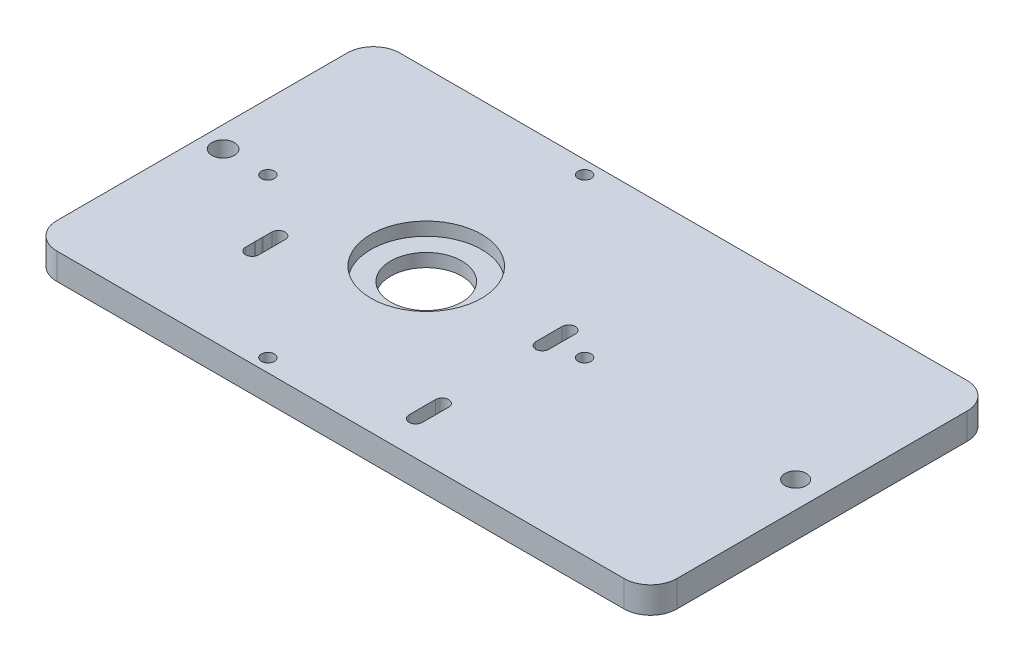
ISO-10303-21;
HEADER;
FILE_DESCRIPTION(('STEP AP214'),'2;1');
FILE_NAME('part.step','',(''),(''),'','','');
FILE_SCHEMA(('AUTOMOTIVE_DESIGN { 1 0 10303 214 1 1 1 1 }'));
ENDSEC;
DATA;
#1=APPLICATION_CONTEXT('core data for automotive mechanical design processes');
#2=APPLICATION_PROTOCOL_DEFINITION('international standard','automotive_design',2000,#1);
#3=PRODUCT_CONTEXT('',#1,'mechanical');
#4=PRODUCT('Part','Part','',(#3));
#5=PRODUCT_RELATED_PRODUCT_CATEGORY('part','',(#4));
#6=PRODUCT_DEFINITION_FORMATION('','',#4);
#7=PRODUCT_DEFINITION_CONTEXT('part definition',#1,'design');
#8=PRODUCT_DEFINITION('design','',#6,#7);
#9=PRODUCT_DEFINITION_SHAPE('','',#8);
#10=(LENGTH_UNIT() NAMED_UNIT(*) SI_UNIT(.MILLI.,.METRE.));
#11=(NAMED_UNIT(*) PLANE_ANGLE_UNIT() SI_UNIT($,.RADIAN.));
#12=(NAMED_UNIT(*) SI_UNIT($,.STERADIAN.) SOLID_ANGLE_UNIT());
#13=UNCERTAINTY_MEASURE_WITH_UNIT(LENGTH_MEASURE(1.E-05),#10,'distance_accuracy_value','');
#14=(GEOMETRIC_REPRESENTATION_CONTEXT(3) GLOBAL_UNCERTAINTY_ASSIGNED_CONTEXT((#13)) GLOBAL_UNIT_ASSIGNED_CONTEXT((#10,
#11,#12)) REPRESENTATION_CONTEXT('',''));
#15=CARTESIAN_POINT('',(0.,0.,0.));
#16=DIRECTION('',(0.,0.,1.));
#17=DIRECTION('',(1.,0.,0.));
#18=AXIS2_PLACEMENT_3D('',#15,#16,#17);
#19=CARTESIAN_POINT('',(-35.5,10.,0.));
#20=DIRECTION('',(1.,0.,0.));
#21=DIRECTION('',(0.,0.,-1.));
#22=AXIS2_PLACEMENT_3D('',#19,#20,#21);
#23=PLANE('',#22);
#24=DIRECTION('',(0.,0.,1.));
#25=VECTOR('',#24,1.);
#26=CARTESIAN_POINT('',(-35.5,0.,0.));
#27=LINE('',#26,#25);
#28=CARTESIAN_POINT('',(-35.5,0.,24.6044361719691));
#29=VERTEX_POINT('',#28);
#30=CARTESIAN_POINT('',(-35.5,0.,28.));
#31=VERTEX_POINT('',#30);
#32=EDGE_CURVE('E359',#29,#31,#27,.T.);
#33=ORIENTED_EDGE('',*,*,#32,.T.);
#34=DIRECTION('',(0.,-1.,0.));
#35=VECTOR('',#34,1.);
#36=CARTESIAN_POINT('',(-35.5,10.,28.));
#37=LINE('',#36,#35);
#38=CARTESIAN_POINT('',(-35.5,10.,28.));
#39=VERTEX_POINT('',#38);
#40=EDGE_CURVE('E409',#39,#31,#37,.T.);
#41=ORIENTED_EDGE('',*,*,#40,.F.);
#42=DIRECTION('',(0.,0.,1.));
#43=VECTOR('',#42,1.);
#44=CARTESIAN_POINT('',(-35.5,10.,0.));
#45=LINE('',#44,#43);
#46=CARTESIAN_POINT('',(-35.5,10.,24.6044361719691));
#47=VERTEX_POINT('',#46);
#48=EDGE_CURVE('E289',#47,#39,#45,.T.);
#49=ORIENTED_EDGE('',*,*,#48,.F.);
#50=DIRECTION('',(0.,-1.,0.));
#51=VECTOR('',#50,1.);
#52=CARTESIAN_POINT('',(-35.5,10.,24.6044361719691));
#53=LINE('',#52,#51);
#54=EDGE_CURVE('E385',#47,#29,#53,.T.);
#55=ORIENTED_EDGE('',*,*,#54,.T.);
#56=EDGE_LOOP('',(#33,#41,#49,#55));
#57=FACE_BOUND('',#56,.T.);
#58=ADVANCED_FACE('F35',(#57),#23,.F.);
#59=CARTESIAN_POINT('',(-38.,10.,28.));
#60=DIRECTION('',(0.,-1.,0.));
#61=DIRECTION('',(0.,0.,-1.));
#62=AXIS2_PLACEMENT_3D('',#59,#60,#61);
#63=CYLINDRICAL_SURFACE('',#62,2.5);
#64=CARTESIAN_POINT('',(-38.,0.,28.));
#65=DIRECTION('',(0.,1.,0.));
#66=DIRECTION('',(0.,0.,1.));
#67=AXIS2_PLACEMENT_3D('',#64,#65,#66);
#68=CIRCLE('',#67,2.5);
#69=CARTESIAN_POINT('',(-40.5,0.,28.));
#70=VERTEX_POINT('',#69);
#71=EDGE_CURVE('E362',#31,#70,#68,.F.);
#72=ORIENTED_EDGE('',*,*,#71,.T.);
#73=DIRECTION('',(0.,-1.,0.));
#74=VECTOR('',#73,1.);
#75=CARTESIAN_POINT('',(-40.5,10.,28.));
#76=LINE('',#75,#74);
#77=CARTESIAN_POINT('',(-40.5,10.,28.));
#78=VERTEX_POINT('',#77);
#79=EDGE_CURVE('E407',#78,#70,#76,.T.);
#80=ORIENTED_EDGE('',*,*,#79,.F.);
#81=CARTESIAN_POINT('',(-38.,10.,28.));
#82=DIRECTION('',(0.,1.,0.));
#83=DIRECTION('',(0.,0.,1.));
#84=AXIS2_PLACEMENT_3D('',#81,#82,#83);
#85=CIRCLE('',#84,2.5);
#86=EDGE_CURVE('E292',#39,#78,#85,.F.);
#87=ORIENTED_EDGE('',*,*,#86,.F.);
#88=ORIENTED_EDGE('',*,*,#40,.T.);
#89=EDGE_LOOP('',(#72,#80,#87,#88));
#90=FACE_BOUND('',#89,.T.);
#91=ADVANCED_FACE('F527',(#90),#63,.F.);
#92=CARTESIAN_POINT('',(-40.5,10.,0.));
#93=DIRECTION('',(1.,0.,0.));
#94=DIRECTION('',(0.,0.,-1.));
#95=AXIS2_PLACEMENT_3D('',#92,#93,#94);
#96=PLANE('',#95);
#97=DIRECTION('',(0.,0.,1.));
#98=VECTOR('',#97,1.);
#99=CARTESIAN_POINT('',(-40.5,0.,0.));
#100=LINE('',#99,#98);
#101=CARTESIAN_POINT('',(-40.5,0.,24.6044361719689));
#102=VERTEX_POINT('',#101);
#103=EDGE_CURVE('E366',#102,#70,#100,.T.);
#104=ORIENTED_EDGE('',*,*,#103,.F.);
#105=DIRECTION('',(0.,-1.,0.));
#106=VECTOR('',#105,1.);
#107=CARTESIAN_POINT('',(-40.5,10.,24.6044361719689));
#108=LINE('',#107,#106);
#109=CARTESIAN_POINT('',(-40.5,10.,24.6044361719689));
#110=VERTEX_POINT('',#109);
#111=EDGE_CURVE('E405',#110,#102,#108,.T.);
#112=ORIENTED_EDGE('',*,*,#111,.F.);
#113=DIRECTION('',(0.,0.,1.));
#114=VECTOR('',#113,1.);
#115=CARTESIAN_POINT('',(-40.5,10.,0.));
#116=LINE('',#115,#114);
#117=EDGE_CURVE('E295',#110,#78,#116,.T.);
#118=ORIENTED_EDGE('',*,*,#117,.T.);
#119=ORIENTED_EDGE('',*,*,#79,.T.);
#120=EDGE_LOOP('',(#104,#112,#118,#119));
#121=FACE_BOUND('',#120,.T.);
#122=ADVANCED_FACE('F534',(#121),#96,.T.);
#123=CARTESIAN_POINT('',(-38.,10.,24.25));
#124=DIRECTION('',(0.,-1.,0.));
#125=DIRECTION('',(0.,0.,-1.));
#126=AXIS2_PLACEMENT_3D('',#123,#124,#125);
#127=CYLINDRICAL_SURFACE('',#126,2.52500000000001);
#128=CARTESIAN_POINT('',(-38.,0.,24.25));
#129=DIRECTION('',(0.,1.,0.));
#130=DIRECTION('',(0.,0.,1.));
#131=AXIS2_PLACEMENT_3D('',#128,#129,#130);
#132=CIRCLE('',#131,2.52500000000001);
#133=CARTESIAN_POINT('',(-40.525,0.,24.25));
#134=VERTEX_POINT('',#133);
#135=EDGE_CURVE('E369',#134,#102,#132,.T.);
#136=ORIENTED_EDGE('',*,*,#135,.F.);
#137=DIRECTION('',(0.,-1.,0.));
#138=VECTOR('',#137,1.);
#139=CARTESIAN_POINT('',(-40.525,10.,24.25));
#140=LINE('',#139,#138);
#141=CARTESIAN_POINT('',(-40.525,10.,24.25));
#142=VERTEX_POINT('',#141);
#143=EDGE_CURVE('E403',#142,#134,#140,.T.);
#144=ORIENTED_EDGE('',*,*,#143,.F.);
#145=CARTESIAN_POINT('',(-38.,10.,24.25));
#146=DIRECTION('',(0.,1.,0.));
#147=DIRECTION('',(0.,0.,1.));
#148=AXIS2_PLACEMENT_3D('',#145,#146,#147);
#149=CIRCLE('',#148,2.52500000000001);
#150=EDGE_CURVE('E298',#142,#110,#149,.T.);
#151=ORIENTED_EDGE('',*,*,#150,.T.);
#152=ORIENTED_EDGE('',*,*,#111,.T.);
#153=EDGE_LOOP('',(#136,#144,#151,#152));
#154=FACE_BOUND('',#153,.T.);
#155=ADVANCED_FACE('F583',(#154),#127,.F.);
#156=CARTESIAN_POINT('',(-40.525,10.,0.));
#157=DIRECTION('',(-1.,0.,0.));
#158=DIRECTION('',(0.,0.,1.));
#159=AXIS2_PLACEMENT_3D('',#156,#157,#158);
#160=PLANE('',#159);
#161=DIRECTION('',(0.,0.,-1.));
#162=VECTOR('',#161,1.);
#163=CARTESIAN_POINT('',(-40.525,0.,0.));
#164=LINE('',#163,#162);
#165=CARTESIAN_POINT('',(-40.525,0.,21.75));
#166=VERTEX_POINT('',#165);
#167=EDGE_CURVE('E373',#134,#166,#164,.T.);
#168=ORIENTED_EDGE('',*,*,#167,.T.);
#169=DIRECTION('',(0.,-1.,0.));
#170=VECTOR('',#169,1.);
#171=CARTESIAN_POINT('',(-40.525,10.,21.75));
#172=LINE('',#171,#170);
#173=CARTESIAN_POINT('',(-40.525,10.,21.75));
#174=VERTEX_POINT('',#173);
#175=EDGE_CURVE('E401',#174,#166,#172,.T.);
#176=ORIENTED_EDGE('',*,*,#175,.F.);
#177=DIRECTION('',(0.,0.,-1.));
#178=VECTOR('',#177,1.);
#179=CARTESIAN_POINT('',(-40.525,10.,0.));
#180=LINE('',#179,#178);
#181=EDGE_CURVE('E302',#142,#174,#180,.T.);
#182=ORIENTED_EDGE('',*,*,#181,.F.);
#183=ORIENTED_EDGE('',*,*,#143,.T.);
#184=EDGE_LOOP('',(#168,#176,#182,#183));
#185=FACE_BOUND('',#184,.T.);
#186=ADVANCED_FACE('F598',(#185),#160,.F.);
#187=CARTESIAN_POINT('',(-38.,10.,21.75));
#188=DIRECTION('',(0.,-1.,0.));
#189=DIRECTION('',(0.,0.,-1.));
#190=AXIS2_PLACEMENT_3D('',#187,#188,#189);
#191=CYLINDRICAL_SURFACE('',#190,2.52500000000001);
#192=CARTESIAN_POINT('',(-38.,0.,21.75));
#193=DIRECTION('',(0.,1.,0.));
#194=DIRECTION('',(0.,0.,1.));
#195=AXIS2_PLACEMENT_3D('',#192,#193,#194);
#196=CIRCLE('',#195,2.52500000000001);
#197=CARTESIAN_POINT('',(-40.5,0.,21.3955638280311));
#198=VERTEX_POINT('',#197);
#199=EDGE_CURVE('E376',#198,#166,#196,.T.);
#200=ORIENTED_EDGE('',*,*,#199,.F.);
#201=DIRECTION('',(0.,-1.,0.));
#202=VECTOR('',#201,1.);
#203=CARTESIAN_POINT('',(-40.5,10.,21.3955638280311));
#204=LINE('',#203,#202);
#205=CARTESIAN_POINT('',(-40.5,10.,21.3955638280311));
#206=VERTEX_POINT('',#205);
#207=EDGE_CURVE('E399',#206,#198,#204,.T.);
#208=ORIENTED_EDGE('',*,*,#207,.F.);
#209=CARTESIAN_POINT('',(-38.,10.,21.75));
#210=DIRECTION('',(0.,1.,0.));
#211=DIRECTION('',(0.,0.,1.));
#212=AXIS2_PLACEMENT_3D('',#209,#210,#211);
#213=CIRCLE('',#212,2.52500000000001);
#214=EDGE_CURVE('E305',#206,#174,#213,.T.);
#215=ORIENTED_EDGE('',*,*,#214,.T.);
#216=ORIENTED_EDGE('',*,*,#175,.T.);
#217=EDGE_LOOP('',(#200,#208,#215,#216));
#218=FACE_BOUND('',#217,.T.);
#219=ADVANCED_FACE('F549',(#218),#191,.F.);
#220=CARTESIAN_POINT('',(-40.5,0.,18.));
#221=VERTEX_POINT('',#220);
#222=EDGE_CURVE('E370',#221,#198,#100,.T.);
#223=ORIENTED_EDGE('',*,*,#222,.F.);
#224=DIRECTION('',(0.,-1.,0.));
#225=VECTOR('',#224,1.);
#226=CARTESIAN_POINT('',(-40.5,10.,18.));
#227=LINE('',#226,#225);
#228=CARTESIAN_POINT('',(-40.5,10.,18.));
#229=VERTEX_POINT('',#228);
#230=EDGE_CURVE('E397',#229,#221,#227,.T.);
#231=ORIENTED_EDGE('',*,*,#230,.F.);
#232=EDGE_CURVE('E299',#229,#206,#116,.T.);
#233=ORIENTED_EDGE('',*,*,#232,.T.);
#234=ORIENTED_EDGE('',*,*,#207,.T.);
#235=EDGE_LOOP('',(#223,#231,#233,#234));
#236=FACE_BOUND('',#235,.T.);
#237=ADVANCED_FACE('F550',(#236),#96,.T.);
#238=CARTESIAN_POINT('',(-38.,10.,18.));
#239=DIRECTION('',(0.,-1.,0.));
#240=DIRECTION('',(0.,0.,-1.));
#241=AXIS2_PLACEMENT_3D('',#238,#239,#240);
#242=CYLINDRICAL_SURFACE('',#241,2.5);
#243=CARTESIAN_POINT('',(-38.,0.,18.));
#244=DIRECTION('',(0.,1.,0.));
#245=DIRECTION('',(0.,0.,1.));
#246=AXIS2_PLACEMENT_3D('',#243,#244,#245);
#247=CIRCLE('',#246,2.5);
#248=CARTESIAN_POINT('',(-35.5,0.,18.));
#249=VERTEX_POINT('',#248);
#250=EDGE_CURVE('E380',#221,#249,#247,.F.);
#251=ORIENTED_EDGE('',*,*,#250,.T.);
#252=DIRECTION('',(0.,-1.,0.));
#253=VECTOR('',#252,1.);
#254=CARTESIAN_POINT('',(-35.5,10.,18.));
#255=LINE('',#254,#253);
#256=CARTESIAN_POINT('',(-35.5,10.,18.));
#257=VERTEX_POINT('',#256);
#258=EDGE_CURVE('E394',#257,#249,#255,.T.);
#259=ORIENTED_EDGE('',*,*,#258,.F.);
#260=CARTESIAN_POINT('',(-38.,10.,18.));
#261=DIRECTION('',(0.,1.,0.));
#262=DIRECTION('',(0.,0.,1.));
#263=AXIS2_PLACEMENT_3D('',#260,#261,#262);
#264=CIRCLE('',#263,2.5);
#265=EDGE_CURVE('E309',#229,#257,#264,.F.);
#266=ORIENTED_EDGE('',*,*,#265,.F.);
#267=ORIENTED_EDGE('',*,*,#230,.T.);
#268=EDGE_LOOP('',(#251,#259,#266,#267));
#269=FACE_BOUND('',#268,.T.);
#270=ADVANCED_FACE('F541',(#269),#242,.F.);
#271=CARTESIAN_POINT('',(-35.5,0.,21.3955638280309));
#272=VERTEX_POINT('',#271);
#273=EDGE_CURVE('E363',#249,#272,#27,.T.);
#274=ORIENTED_EDGE('',*,*,#273,.T.);
#275=DIRECTION('',(0.,-1.,0.));
#276=VECTOR('',#275,1.);
#277=CARTESIAN_POINT('',(-35.5,10.,21.3955638280309));
#278=LINE('',#277,#276);
#279=CARTESIAN_POINT('',(-35.5,10.,21.3955638280309));
#280=VERTEX_POINT('',#279);
#281=EDGE_CURVE('E392',#280,#272,#278,.T.);
#282=ORIENTED_EDGE('',*,*,#281,.F.);
#283=EDGE_CURVE('E293',#257,#280,#45,.T.);
#284=ORIENTED_EDGE('',*,*,#283,.F.);
#285=ORIENTED_EDGE('',*,*,#258,.T.);
#286=EDGE_LOOP('',(#274,#282,#284,#285));
#287=FACE_BOUND('',#286,.T.);
#288=ADVANCED_FACE('F530',(#287),#23,.F.);
#289=CARTESIAN_POINT('',(-35.475,0.,21.75));
#290=VERTEX_POINT('',#289);
#291=EDGE_CURVE('E379',#290,#272,#196,.T.);
#292=ORIENTED_EDGE('',*,*,#291,.F.);
#293=DIRECTION('',(0.,-1.,0.));
#294=VECTOR('',#293,1.);
#295=CARTESIAN_POINT('',(-35.475,10.,21.75));
#296=LINE('',#295,#294);
#297=CARTESIAN_POINT('',(-35.475,10.,21.75));
#298=VERTEX_POINT('',#297);
#299=EDGE_CURVE('E390',#298,#290,#296,.T.);
#300=ORIENTED_EDGE('',*,*,#299,.F.);
#301=EDGE_CURVE('E308',#298,#280,#213,.T.);
#302=ORIENTED_EDGE('',*,*,#301,.T.);
#303=ORIENTED_EDGE('',*,*,#281,.T.);
#304=EDGE_LOOP('',(#292,#300,#302,#303));
#305=FACE_BOUND('',#304,.T.);
#306=ADVANCED_FACE('F540',(#305),#191,.F.);
#307=CARTESIAN_POINT('',(-35.475,10.,0.));
#308=DIRECTION('',(-1.,0.,0.));
#309=DIRECTION('',(0.,0.,1.));
#310=AXIS2_PLACEMENT_3D('',#307,#308,#309);
#311=PLANE('',#310);
#312=DIRECTION('',(0.,0.,-1.));
#313=VECTOR('',#312,1.);
#314=CARTESIAN_POINT('',(-35.475,0.,0.));
#315=LINE('',#314,#313);
#316=CARTESIAN_POINT('',(-35.475,0.,24.25));
#317=VERTEX_POINT('',#316);
#318=EDGE_CURVE('E382',#317,#290,#315,.T.);
#319=ORIENTED_EDGE('',*,*,#318,.F.);
#320=DIRECTION('',(0.,-1.,0.));
#321=VECTOR('',#320,1.);
#322=CARTESIAN_POINT('',(-35.475,10.,24.25));
#323=LINE('',#322,#321);
#324=CARTESIAN_POINT('',(-35.475,10.,24.25));
#325=VERTEX_POINT('',#324);
#326=EDGE_CURVE('E387',#325,#317,#323,.T.);
#327=ORIENTED_EDGE('',*,*,#326,.F.);
#328=DIRECTION('',(0.,0.,-1.));
#329=VECTOR('',#328,1.);
#330=CARTESIAN_POINT('',(-35.475,10.,0.));
#331=LINE('',#330,#329);
#332=EDGE_CURVE('E311',#325,#298,#331,.T.);
#333=ORIENTED_EDGE('',*,*,#332,.T.);
#334=ORIENTED_EDGE('',*,*,#299,.T.);
#335=EDGE_LOOP('',(#319,#327,#333,#334));
#336=FACE_BOUND('',#335,.T.);
#337=ADVANCED_FACE('F547',(#336),#311,.T.);
#338=CARTESIAN_POINT('',(50.5,10.,0.));
#339=DIRECTION('',(1.,0.,0.));
#340=DIRECTION('',(0.,0.,-1.));
#341=AXIS2_PLACEMENT_3D('',#338,#339,#340);
#342=PLANE('',#341);
#343=DIRECTION('',(0.,0.,1.));
#344=VECTOR('',#343,1.);
#345=CARTESIAN_POINT('',(50.5,0.,0.));
#346=LINE('',#345,#344);
#347=CARTESIAN_POINT('',(50.5,0.,-5.99999999999999));
#348=VERTEX_POINT('',#347);
#349=CARTESIAN_POINT('',(50.5,0.,4.));
#350=VERTEX_POINT('',#349);
#351=EDGE_CURVE('E348',#348,#350,#346,.T.);
#352=ORIENTED_EDGE('',*,*,#351,.T.);
#353=DIRECTION('',(0.,-1.,0.));
#354=VECTOR('',#353,1.);
#355=CARTESIAN_POINT('',(50.5,10.,4.));
#356=LINE('',#355,#354);
#357=CARTESIAN_POINT('',(50.5,10.,4.));
#358=VERTEX_POINT('',#357);
#359=EDGE_CURVE('E388',#358,#350,#356,.T.);
#360=ORIENTED_EDGE('',*,*,#359,.F.);
#361=DIRECTION('',(0.,0.,1.));
#362=VECTOR('',#361,1.);
#363=CARTESIAN_POINT('',(50.5,10.,0.));
#364=LINE('',#363,#362);
#365=CARTESIAN_POINT('',(50.5,10.,-5.99999999999999));
#366=VERTEX_POINT('',#365);
#367=EDGE_CURVE('E279',#366,#358,#364,.T.);
#368=ORIENTED_EDGE('',*,*,#367,.F.);
#369=DIRECTION('',(0.,-1.,0.));
#370=VECTOR('',#369,1.);
#371=CARTESIAN_POINT('',(50.5,10.,-5.99999999999999));
#372=LINE('',#371,#370);
#373=EDGE_CURVE('E243',#366,#348,#372,.T.);
#374=ORIENTED_EDGE('',*,*,#373,.T.);
#375=EDGE_LOOP('',(#352,#360,#368,#374));
#376=FACE_BOUND('',#375,.T.);
#377=ADVANCED_FACE('F621',(#376),#342,.F.);
#378=CARTESIAN_POINT('',(48.,10.,4.));
#379=DIRECTION('',(0.,-1.,0.));
#380=DIRECTION('',(0.,0.,-1.));
#381=AXIS2_PLACEMENT_3D('',#378,#379,#380);
#382=CYLINDRICAL_SURFACE('',#381,2.5);
#383=CARTESIAN_POINT('',(48.,0.,4.));
#384=DIRECTION('',(0.,1.,0.));
#385=DIRECTION('',(0.,0.,1.));
#386=AXIS2_PLACEMENT_3D('',#383,#384,#385);
#387=CIRCLE('',#386,2.5);
#388=CARTESIAN_POINT('',(45.5,0.,4.));
#389=VERTEX_POINT('',#388);
#390=EDGE_CURVE('E351',#350,#389,#387,.F.);
#391=ORIENTED_EDGE('',*,*,#390,.T.);
#392=DIRECTION('',(0.,-1.,0.));
#393=VECTOR('',#392,1.);
#394=CARTESIAN_POINT('',(45.5,10.,4.));
#395=LINE('',#394,#393);
#396=CARTESIAN_POINT('',(45.5,10.,4.));
#397=VERTEX_POINT('',#396);
#398=EDGE_CURVE('E417',#397,#389,#395,.T.);
#399=ORIENTED_EDGE('',*,*,#398,.F.);
#400=CARTESIAN_POINT('',(48.,10.,4.));
#401=DIRECTION('',(0.,1.,0.));
#402=DIRECTION('',(0.,0.,1.));
#403=AXIS2_PLACEMENT_3D('',#400,#401,#402);
#404=CIRCLE('',#403,2.5);
#405=EDGE_CURVE('E282',#358,#397,#404,.F.);
#406=ORIENTED_EDGE('',*,*,#405,.F.);
#407=ORIENTED_EDGE('',*,*,#359,.T.);
#408=EDGE_LOOP('',(#391,#399,#406,#407));
#409=FACE_BOUND('',#408,.T.);
#410=ADVANCED_FACE('F617',(#409),#382,.F.);
#411=CARTESIAN_POINT('',(45.5,10.,0.));
#412=DIRECTION('',(1.,0.,0.));
#413=DIRECTION('',(0.,0.,-1.));
#414=AXIS2_PLACEMENT_3D('',#411,#412,#413);
#415=PLANE('',#414);
#416=DIRECTION('',(0.,0.,1.));
#417=VECTOR('',#416,1.);
#418=CARTESIAN_POINT('',(45.5,0.,0.));
#419=LINE('',#418,#417);
#420=CARTESIAN_POINT('',(45.5,0.,-5.99999999999999));
#421=VERTEX_POINT('',#420);
#422=EDGE_CURVE('E354',#421,#389,#419,.T.);
#423=ORIENTED_EDGE('',*,*,#422,.F.);
#424=DIRECTION('',(0.,-1.,0.));
#425=VECTOR('',#424,1.);
#426=CARTESIAN_POINT('',(45.5,10.,-5.99999999999999));
#427=LINE('',#426,#425);
#428=CARTESIAN_POINT('',(45.5,10.,-5.99999999999999));
#429=VERTEX_POINT('',#428);
#430=EDGE_CURVE('E415',#429,#421,#427,.T.);
#431=ORIENTED_EDGE('',*,*,#430,.F.);
#432=DIRECTION('',(0.,0.,1.));
#433=VECTOR('',#432,1.);
#434=CARTESIAN_POINT('',(45.5,10.,0.));
#435=LINE('',#434,#433);
#436=EDGE_CURVE('E284',#429,#397,#435,.T.);
#437=ORIENTED_EDGE('',*,*,#436,.T.);
#438=ORIENTED_EDGE('',*,*,#398,.T.);
#439=EDGE_LOOP('',(#423,#431,#437,#438));
#440=FACE_BOUND('',#439,.T.);
#441=ADVANCED_FACE('F614',(#440),#415,.T.);
#442=CARTESIAN_POINT('',(0.,10.,65.));
#443=DIRECTION('',(0.,0.,1.));
#444=DIRECTION('',(1.,0.,0.));
#445=AXIS2_PLACEMENT_3D('',#442,#443,#444);
#446=PLANE('',#445);
#447=DIRECTION('',(-1.,0.,0.));
#448=VECTOR('',#447,1.);
#449=CARTESIAN_POINT('',(0.,10.,65.));
#450=LINE('',#449,#448);
#451=CARTESIAN_POINT('',(140.,10.,65.));
#452=VERTEX_POINT('',#451);
#453=CARTESIAN_POINT('',(-75.,10.,65.));
#454=VERTEX_POINT('',#453);
#455=EDGE_CURVE('E256',#452,#454,#450,.T.);
#456=ORIENTED_EDGE('',*,*,#455,.T.);
#457=DIRECTION('',(0.,-1.,0.));
#458=VECTOR('',#457,1.);
#459=CARTESIAN_POINT('',(-75.,0.,65.));
#460=LINE('',#459,#458);
#461=CARTESIAN_POINT('',(-75.,0.,65.));
#462=VERTEX_POINT('',#461);
#463=EDGE_CURVE('E455',#454,#462,#460,.T.);
#464=ORIENTED_EDGE('',*,*,#463,.T.);
#465=DIRECTION('',(-1.,0.,0.));
#466=VECTOR('',#465,1.);
#467=CARTESIAN_POINT('',(0.,0.,65.));
#468=LINE('',#467,#466);
#469=CARTESIAN_POINT('',(140.,0.,65.));
#470=VERTEX_POINT('',#469);
#471=EDGE_CURVE('E327',#470,#462,#468,.T.);
#472=ORIENTED_EDGE('',*,*,#471,.F.);
#473=DIRECTION('',(0.,-1.,0.));
#474=VECTOR('',#473,1.);
#475=CARTESIAN_POINT('',(140.,10.,65.));
#476=LINE('',#475,#474);
#477=EDGE_CURVE('E453',#470,#452,#476,.F.);
#478=ORIENTED_EDGE('',*,*,#477,.T.);
#479=EDGE_LOOP('',(#456,#464,#472,#478));
#480=FACE_BOUND('',#479,.T.);
#481=ADVANCED_FACE('F460',(#480),#446,.T.);
#482=CARTESIAN_POINT('',(150.,10.,0.));
#483=DIRECTION('',(1.,0.,0.));
#484=DIRECTION('',(0.,0.,-1.));
#485=AXIS2_PLACEMENT_3D('',#482,#483,#484);
#486=PLANE('',#485);
#487=DIRECTION('',(0.,0.,1.));
#488=VECTOR('',#487,1.);
#489=CARTESIAN_POINT('',(150.,10.,0.));
#490=LINE('',#489,#488);
#491=CARTESIAN_POINT('',(150.,10.,-55.));
#492=VERTEX_POINT('',#491);
#493=CARTESIAN_POINT('',(150.,10.,55.));
#494=VERTEX_POINT('',#493);
#495=EDGE_CURVE('E259',#492,#494,#490,.T.);
#496=ORIENTED_EDGE('',*,*,#495,.T.);
#497=DIRECTION('',(0.,-1.,0.));
#498=VECTOR('',#497,1.);
#499=CARTESIAN_POINT('',(150.,10.,55.));
#500=LINE('',#499,#498);
#501=CARTESIAN_POINT('',(150.,0.,55.));
#502=VERTEX_POINT('',#501);
#503=EDGE_CURVE('E11',#494,#502,#500,.T.);
#504=ORIENTED_EDGE('',*,*,#503,.T.);
#505=DIRECTION('',(0.,0.,1.));
#506=VECTOR('',#505,1.);
#507=CARTESIAN_POINT('',(150.,0.,0.));
#508=LINE('',#507,#506);
#509=CARTESIAN_POINT('',(150.,0.,-55.));
#510=VERTEX_POINT('',#509);
#511=EDGE_CURVE('E330',#510,#502,#508,.T.);
#512=ORIENTED_EDGE('',*,*,#511,.F.);
#513=DIRECTION('',(0.,-1.,0.));
#514=VECTOR('',#513,1.);
#515=CARTESIAN_POINT('',(150.,10.,-55.));
#516=LINE('',#515,#514);
#517=EDGE_CURVE('E43',#510,#492,#516,.F.);
#518=ORIENTED_EDGE('',*,*,#517,.T.);
#519=EDGE_LOOP('',(#496,#504,#512,#518));
#520=FACE_BOUND('',#519,.T.);
#521=ADVANCED_FACE('F472',(#520),#486,.T.);
#522=CARTESIAN_POINT('',(45.5,10.,0.));
#523=DIRECTION('',(-1.,0.,0.));
#524=DIRECTION('',(0.,0.,1.));
#525=AXIS2_PLACEMENT_3D('',#522,#523,#524);
#526=PLANE('',#525);
#527=DIRECTION('',(0.,0.,-1.));
#528=VECTOR('',#527,1.);
#529=CARTESIAN_POINT('',(45.5,0.,0.));
#530=LINE('',#529,#528);
#531=CARTESIAN_POINT('',(45.5,0.,52.));
#532=VERTEX_POINT('',#531);
#533=CARTESIAN_POINT('',(45.5,0.,42.));
#534=VERTEX_POINT('',#533);
#535=EDGE_CURVE('E239',#532,#534,#530,.T.);
#536=ORIENTED_EDGE('',*,*,#535,.T.);
#537=DIRECTION('',(0.,-1.,0.));
#538=VECTOR('',#537,1.);
#539=CARTESIAN_POINT('',(45.5,10.,42.));
#540=LINE('',#539,#538);
#541=CARTESIAN_POINT('',(45.5,10.,42.));
#542=VERTEX_POINT('',#541);
#543=EDGE_CURVE('E236',#542,#534,#540,.T.);
#544=ORIENTED_EDGE('',*,*,#543,.F.);
#545=DIRECTION('',(0.,0.,-1.));
#546=VECTOR('',#545,1.);
#547=CARTESIAN_POINT('',(45.5,10.,0.));
#548=LINE('',#547,#546);
#549=CARTESIAN_POINT('',(45.5,10.,52.));
#550=VERTEX_POINT('',#549);
#551=EDGE_CURVE('E222',#550,#542,#548,.T.);
#552=ORIENTED_EDGE('',*,*,#551,.F.);
#553=DIRECTION('',(0.,-1.,0.));
#554=VECTOR('',#553,1.);
#555=CARTESIAN_POINT('',(45.5,10.,52.));
#556=LINE('',#555,#554);
#557=EDGE_CURVE('E421',#550,#532,#556,.T.);
#558=ORIENTED_EDGE('',*,*,#557,.T.);
#559=EDGE_LOOP('',(#536,#544,#552,#558));
#560=FACE_BOUND('',#559,.T.);
#561=ADVANCED_FACE('F237',(#560),#526,.F.);
#562=CARTESIAN_POINT('',(48.,10.,42.));
#563=DIRECTION('',(0.,-1.,0.));
#564=DIRECTION('',(0.,0.,-1.));
#565=AXIS2_PLACEMENT_3D('',#562,#563,#564);
#566=CYLINDRICAL_SURFACE('',#565,2.5);
#567=CARTESIAN_POINT('',(48.,0.,42.));
#568=DIRECTION('',(0.,1.,0.));
#569=DIRECTION('',(0.,0.,1.));
#570=AXIS2_PLACEMENT_3D('',#567,#568,#569);
#571=CIRCLE('',#570,2.5);
#572=CARTESIAN_POINT('',(50.5,0.,42.));
#573=VERTEX_POINT('',#572);
#574=EDGE_CURVE('E315',#573,#534,#571,.T.);
#575=ORIENTED_EDGE('',*,*,#574,.F.);
#576=DIRECTION('',(0.,-1.,0.));
#577=VECTOR('',#576,1.);
#578=CARTESIAN_POINT('',(50.5,10.,42.));
#579=LINE('',#578,#577);
#580=CARTESIAN_POINT('',(50.5,10.,42.));
#581=VERTEX_POINT('',#580);
#582=EDGE_CURVE('E244',#581,#573,#579,.T.);
#583=ORIENTED_EDGE('',*,*,#582,.F.);
#584=CARTESIAN_POINT('',(48.,10.,42.));
#585=DIRECTION('',(0.,1.,0.));
#586=DIRECTION('',(0.,0.,1.));
#587=AXIS2_PLACEMENT_3D('',#584,#585,#586);
#588=CIRCLE('',#587,2.5);
#589=EDGE_CURVE('E228',#581,#542,#588,.T.);
#590=ORIENTED_EDGE('',*,*,#589,.T.);
#591=ORIENTED_EDGE('',*,*,#543,.T.);
#592=EDGE_LOOP('',(#575,#583,#590,#591));
#593=FACE_BOUND('',#592,.T.);
#594=ADVANCED_FACE('F246',(#593),#566,.F.);
#595=CARTESIAN_POINT('',(50.5,10.,0.));
#596=DIRECTION('',(-1.,0.,0.));
#597=DIRECTION('',(0.,0.,1.));
#598=AXIS2_PLACEMENT_3D('',#595,#596,#597);
#599=PLANE('',#598);
#600=DIRECTION('',(0.,0.,-1.));
#601=VECTOR('',#600,1.);
#602=CARTESIAN_POINT('',(50.5,0.,0.));
#603=LINE('',#602,#601);
#604=CARTESIAN_POINT('',(50.5,0.,52.));
#605=VERTEX_POINT('',#604);
#606=EDGE_CURVE('E318',#605,#573,#603,.T.);
#607=ORIENTED_EDGE('',*,*,#606,.F.);
#608=DIRECTION('',(0.,-1.,0.));
#609=VECTOR('',#608,1.);
#610=CARTESIAN_POINT('',(50.5,10.,52.));
#611=LINE('',#610,#609);
#612=CARTESIAN_POINT('',(50.5,10.,52.));
#613=VERTEX_POINT('',#612);
#614=EDGE_CURVE('E423',#613,#605,#611,.T.);
#615=ORIENTED_EDGE('',*,*,#614,.F.);
#616=DIRECTION('',(0.,0.,-1.));
#617=VECTOR('',#616,1.);
#618=CARTESIAN_POINT('',(50.5,10.,0.));
#619=LINE('',#618,#617);
#620=EDGE_CURVE('E247',#613,#581,#619,.T.);
#621=ORIENTED_EDGE('',*,*,#620,.T.);
#622=ORIENTED_EDGE('',*,*,#582,.T.);
#623=EDGE_LOOP('',(#607,#615,#621,#622));
#624=FACE_BOUND('',#623,.T.);
#625=ADVANCED_FACE('F612',(#624),#599,.T.);
#626=CARTESIAN_POINT('',(48.,10.,-6.));
#627=DIRECTION('',(0.,-1.,0.));
#628=DIRECTION('',(0.,0.,-1.));
#629=AXIS2_PLACEMENT_3D('',#626,#627,#628);
#630=CYLINDRICAL_SURFACE('',#629,2.5);
#631=CARTESIAN_POINT('',(48.,0.,-6.));
#632=DIRECTION('',(0.,1.,0.));
#633=DIRECTION('',(0.,0.,1.));
#634=AXIS2_PLACEMENT_3D('',#631,#632,#633);
#635=CIRCLE('',#634,2.5);
#636=EDGE_CURVE('E357',#421,#348,#635,.F.);
#637=ORIENTED_EDGE('',*,*,#636,.T.);
#638=ORIENTED_EDGE('',*,*,#373,.F.);
#639=CARTESIAN_POINT('',(48.,10.,-6.));
#640=DIRECTION('',(0.,1.,0.));
#641=DIRECTION('',(0.,0.,1.));
#642=AXIS2_PLACEMENT_3D('',#639,#640,#641);
#643=CIRCLE('',#642,2.5);
#644=EDGE_CURVE('E287',#429,#366,#643,.F.);
#645=ORIENTED_EDGE('',*,*,#644,.F.);
#646=ORIENTED_EDGE('',*,*,#430,.T.);
#647=EDGE_LOOP('',(#637,#638,#645,#646));
#648=FACE_BOUND('',#647,.T.);
#649=ADVANCED_FACE('F608',(#648),#630,.F.);
#650=CARTESIAN_POINT('',(0.,10.,0.));
#651=DIRECTION('',(0.,-1.,0.));
#652=DIRECTION('',(0.,0.,-1.));
#653=AXIS2_PLACEMENT_3D('',#650,#651,#652);
#654=CYLINDRICAL_SURFACE('',#653,21.);
#655=CARTESIAN_POINT('',(0.,5.,0.));
#656=DIRECTION('',(0.,1.,0.));
#657=DIRECTION('',(0.,0.,1.));
#658=AXIS2_PLACEMENT_3D('',#655,#656,#657);
#659=CIRCLE('',#658,21.);
#660=CARTESIAN_POINT('',(0.,5.,21.));
#661=VERTEX_POINT('',#660);
#662=EDGE_CURVE('E412',#661,#661,#659,.T.);
#663=ORIENTED_EDGE('',*,*,#662,.F.);
#664=EDGE_LOOP('',(#663));
#665=FACE_BOUND('',#664,.T.);
#666=CARTESIAN_POINT('',(0.,10.,0.));
#667=DIRECTION('',(0.,1.,0.));
#668=DIRECTION('',(0.,0.,1.));
#669=AXIS2_PLACEMENT_3D('',#666,#667,#668);
#670=CIRCLE('',#669,21.);
#671=CARTESIAN_POINT('',(0.,10.,21.));
#672=VERTEX_POINT('',#671);
#673=EDGE_CURVE('E276',#672,#672,#670,.T.);
#674=ORIENTED_EDGE('',*,*,#673,.T.);
#675=EDGE_LOOP('',(#674));
#676=FACE_BOUND('',#675,.T.);
#677=ADVANCED_FACE('F611',(#665,#676),#654,.F.);
#678=CARTESIAN_POINT('',(0.,10.,-60.));
#679=DIRECTION('',(0.,-1.,0.));
#680=DIRECTION('',(0.,0.,-1.));
#681=AXIS2_PLACEMENT_3D('',#678,#679,#680);
#682=CYLINDRICAL_SURFACE('',#681,2.475);
#683=CARTESIAN_POINT('',(0.,10.,-60.));
#684=DIRECTION('',(0.,1.,0.));
#685=DIRECTION('',(0.,0.,1.));
#686=AXIS2_PLACEMENT_3D('',#683,#684,#685);
#687=CIRCLE('',#686,2.475);
#688=CARTESIAN_POINT('',(0.,10.,-57.525));
#689=VERTEX_POINT('',#688);
#690=EDGE_CURVE('E273',#689,#689,#687,.T.);
#691=ORIENTED_EDGE('',*,*,#690,.T.);
#692=EDGE_LOOP('',(#691));
#693=FACE_BOUND('',#692,.T.);
#694=CARTESIAN_POINT('',(0.,0.,-60.));
#695=DIRECTION('',(0.,1.,0.));
#696=DIRECTION('',(0.,0.,1.));
#697=AXIS2_PLACEMENT_3D('',#694,#695,#696);
#698=CIRCLE('',#697,2.475);
#699=CARTESIAN_POINT('',(0.,0.,-57.525));
#700=VERTEX_POINT('',#699);
#701=EDGE_CURVE('E345',#700,#700,#698,.T.);
#702=ORIENTED_EDGE('',*,*,#701,.F.);
#703=EDGE_LOOP('',(#702));
#704=FACE_BOUND('',#703,.T.);
#705=ADVANCED_FACE('F628',(#693,#704),#682,.F.);
#706=CARTESIAN_POINT('',(60.0000000000016,10.,-1.61324064779776E-12));
#707=DIRECTION('',(0.,-1.,0.));
#708=DIRECTION('',(0.,0.,-1.));
#709=AXIS2_PLACEMENT_3D('',#706,#707,#708);
#710=CYLINDRICAL_SURFACE('',#709,2.475);
#711=CARTESIAN_POINT('',(60.0000000000016,10.,-1.61324064779776E-12));
#712=DIRECTION('',(0.,1.,0.));
#713=DIRECTION('',(0.,0.,1.));
#714=AXIS2_PLACEMENT_3D('',#711,#712,#713);
#715=CIRCLE('',#714,2.475);
#716=CARTESIAN_POINT('',(60.0000000000016,10.,2.47499999999838));
#717=VERTEX_POINT('',#716);
#718=EDGE_CURVE('E270',#717,#717,#715,.T.);
#719=ORIENTED_EDGE('',*,*,#718,.T.);
#720=EDGE_LOOP('',(#719));
#721=FACE_BOUND('',#720,.T.);
#722=CARTESIAN_POINT('',(60.0000000000016,0.,-1.61324064779776E-12));
#723=DIRECTION('',(0.,1.,0.));
#724=DIRECTION('',(0.,0.,1.));
#725=AXIS2_PLACEMENT_3D('',#722,#723,#724);
#726=CIRCLE('',#725,2.475);
#727=CARTESIAN_POINT('',(60.0000000000016,0.,2.47499999999838));
#728=VERTEX_POINT('',#727);
#729=EDGE_CURVE('E342',#728,#728,#726,.T.);
#730=ORIENTED_EDGE('',*,*,#729,.F.);
#731=EDGE_LOOP('',(#730));
#732=FACE_BOUND('',#731,.T.);
#733=ADVANCED_FACE('F632',(#721,#732),#710,.F.);
#734=CARTESIAN_POINT('',(3.22648129559552E-12,10.,60.));
#735=DIRECTION('',(0.,-1.,0.));
#736=DIRECTION('',(0.,0.,-1.));
#737=AXIS2_PLACEMENT_3D('',#734,#735,#736);
#738=CYLINDRICAL_SURFACE('',#737,2.475);
#739=CARTESIAN_POINT('',(3.22648129559552E-12,10.,60.));
#740=DIRECTION('',(0.,1.,0.));
#741=DIRECTION('',(0.,0.,1.));
#742=AXIS2_PLACEMENT_3D('',#739,#740,#741);
#743=CIRCLE('',#742,2.475);
#744=CARTESIAN_POINT('',(3.22648129559552E-12,10.,62.475));
#745=VERTEX_POINT('',#744);
#746=EDGE_CURVE('E267',#745,#745,#743,.T.);
#747=ORIENTED_EDGE('',*,*,#746,.T.);
#748=EDGE_LOOP('',(#747));
#749=FACE_BOUND('',#748,.T.);
#750=CARTESIAN_POINT('',(3.22648129559552E-12,0.,60.));
#751=DIRECTION('',(0.,1.,0.));
#752=DIRECTION('',(0.,0.,1.));
#753=AXIS2_PLACEMENT_3D('',#750,#751,#752);
#754=CIRCLE('',#753,2.475);
#755=CARTESIAN_POINT('',(3.22648129559552E-12,0.,62.475));
#756=VERTEX_POINT('',#755);
#757=EDGE_CURVE('E339',#756,#756,#754,.T.);
#758=ORIENTED_EDGE('',*,*,#757,.F.);
#759=EDGE_LOOP('',(#758));
#760=FACE_BOUND('',#759,.T.);
#761=ADVANCED_FACE('F636',(#749,#760),#738,.F.);
#762=CARTESIAN_POINT('',(-59.9999999999984,10.,1.62058852859264E-12));
#763=DIRECTION('',(0.,-1.,0.));
#764=DIRECTION('',(0.,0.,-1.));
#765=AXIS2_PLACEMENT_3D('',#762,#763,#764);
#766=CYLINDRICAL_SURFACE('',#765,2.475);
#767=CARTESIAN_POINT('',(-59.9999999999984,10.,1.62058852859264E-12));
#768=DIRECTION('',(0.,1.,0.));
#769=DIRECTION('',(0.,0.,1.));
#770=AXIS2_PLACEMENT_3D('',#767,#768,#769);
#771=CIRCLE('',#770,2.475);
#772=CARTESIAN_POINT('',(-59.9999999999984,10.,2.47500000000162));
#773=VERTEX_POINT('',#772);
#774=EDGE_CURVE('E264',#773,#773,#771,.T.);
#775=ORIENTED_EDGE('',*,*,#774,.T.);
#776=EDGE_LOOP('',(#775));
#777=FACE_BOUND('',#776,.T.);
#778=CARTESIAN_POINT('',(-59.9999999999984,0.,1.62058852859264E-12));
#779=DIRECTION('',(0.,1.,0.));
#780=DIRECTION('',(0.,0.,1.));
#781=AXIS2_PLACEMENT_3D('',#778,#779,#780);
#782=CIRCLE('',#781,2.475);
#783=CARTESIAN_POINT('',(-59.9999999999984,0.,2.47500000000162));
#784=VERTEX_POINT('',#783);
#785=EDGE_CURVE('E336',#784,#784,#782,.T.);
#786=ORIENTED_EDGE('',*,*,#785,.F.);
#787=EDGE_LOOP('',(#786));
#788=FACE_BOUND('',#787,.T.);
#789=ADVANCED_FACE('F640',(#777,#788),#766,.F.);
#790=CARTESIAN_POINT('',(0.,10.,-65.));
#791=DIRECTION('',(0.,0.,-1.));
#792=DIRECTION('',(-1.,0.,0.));
#793=AXIS2_PLACEMENT_3D('',#790,#791,#792);
#794=PLANE('',#793);
#795=DIRECTION('',(1.,0.,0.));
#796=VECTOR('',#795,1.);
#797=CARTESIAN_POINT('',(0.,0.,-65.));
#798=LINE('',#797,#796);
#799=CARTESIAN_POINT('',(-75.,0.,-65.));
#800=VERTEX_POINT('',#799);
#801=CARTESIAN_POINT('',(140.,0.,-65.));
#802=VERTEX_POINT('',#801);
#803=EDGE_CURVE('E333',#800,#802,#798,.T.);
#804=ORIENTED_EDGE('',*,*,#803,.F.);
#805=DIRECTION('',(0.,-1.,0.));
#806=VECTOR('',#805,1.);
#807=CARTESIAN_POINT('',(-75.,10.,-65.));
#808=LINE('',#807,#806);
#809=CARTESIAN_POINT('',(-75.,10.,-65.));
#810=VERTEX_POINT('',#809);
#811=EDGE_CURVE('E444',#800,#810,#808,.F.);
#812=ORIENTED_EDGE('',*,*,#811,.T.);
#813=DIRECTION('',(1.,0.,0.));
#814=VECTOR('',#813,1.);
#815=CARTESIAN_POINT('',(0.,10.,-65.));
#816=LINE('',#815,#814);
#817=CARTESIAN_POINT('',(140.,10.,-65.));
#818=VERTEX_POINT('',#817);
#819=EDGE_CURVE('E261',#810,#818,#816,.T.);
#820=ORIENTED_EDGE('',*,*,#819,.T.);
#821=DIRECTION('',(0.,-1.,0.));
#822=VECTOR('',#821,1.);
#823=CARTESIAN_POINT('',(140.,10.,-65.));
#824=LINE('',#823,#822);
#825=EDGE_CURVE('E441',#818,#802,#824,.T.);
#826=ORIENTED_EDGE('',*,*,#825,.T.);
#827=EDGE_LOOP('',(#804,#812,#820,#826));
#828=FACE_BOUND('',#827,.T.);
#829=ADVANCED_FACE('F480',(#828),#794,.T.);
#830=CARTESIAN_POINT('',(140.,10.,0.));
#831=DIRECTION('',(0.,-1.,0.));
#832=DIRECTION('',(0.,0.,-1.));
#833=AXIS2_PLACEMENT_3D('',#830,#831,#832);
#834=CYLINDRICAL_SURFACE('',#833,4.025);
#835=CARTESIAN_POINT('',(140.,10.,0.));
#836=DIRECTION('',(0.,1.,0.));
#837=DIRECTION('',(0.,0.,1.));
#838=AXIS2_PLACEMENT_3D('',#835,#836,#837);
#839=CIRCLE('',#838,4.025);
#840=CARTESIAN_POINT('',(140.,10.,4.025));
#841=VERTEX_POINT('',#840);
#842=EDGE_CURVE('E253',#841,#841,#839,.T.);
#843=ORIENTED_EDGE('',*,*,#842,.T.);
#844=EDGE_LOOP('',(#843));
#845=FACE_BOUND('',#844,.T.);
#846=CARTESIAN_POINT('',(140.,0.,0.));
#847=DIRECTION('',(0.,1.,0.));
#848=DIRECTION('',(0.,0.,1.));
#849=AXIS2_PLACEMENT_3D('',#846,#847,#848);
#850=CIRCLE('',#849,4.025);
#851=CARTESIAN_POINT('',(140.,0.,4.025));
#852=VERTEX_POINT('',#851);
#853=EDGE_CURVE('E324',#852,#852,#850,.T.);
#854=ORIENTED_EDGE('',*,*,#853,.F.);
#855=EDGE_LOOP('',(#854));
#856=FACE_BOUND('',#855,.T.);
#857=ADVANCED_FACE('F647',(#845,#856),#834,.F.);
#858=CARTESIAN_POINT('',(48.,10.,52.));
#859=DIRECTION('',(0.,-1.,0.));
#860=DIRECTION('',(0.,0.,-1.));
#861=AXIS2_PLACEMENT_3D('',#858,#859,#860);
#862=CYLINDRICAL_SURFACE('',#861,2.5);
#863=CARTESIAN_POINT('',(48.,0.,52.));
#864=DIRECTION('',(0.,1.,0.));
#865=DIRECTION('',(0.,0.,1.));
#866=AXIS2_PLACEMENT_3D('',#863,#864,#865);
#867=CIRCLE('',#866,2.5);
#868=EDGE_CURVE('E321',#532,#605,#867,.T.);
#869=ORIENTED_EDGE('',*,*,#868,.F.);
#870=ORIENTED_EDGE('',*,*,#557,.F.);
#871=CARTESIAN_POINT('',(48.,10.,52.));
#872=DIRECTION('',(0.,1.,0.));
#873=DIRECTION('',(0.,0.,1.));
#874=AXIS2_PLACEMENT_3D('',#871,#872,#873);
#875=CIRCLE('',#874,2.5);
#876=EDGE_CURVE('E231',#550,#613,#875,.T.);
#877=ORIENTED_EDGE('',*,*,#876,.T.);
#878=ORIENTED_EDGE('',*,*,#614,.T.);
#879=EDGE_LOOP('',(#869,#870,#877,#878));
#880=FACE_BOUND('',#879,.T.);
#881=ADVANCED_FACE('F654',(#880),#862,.F.);
#882=EDGE_CURVE('E233',#29,#317,#132,.T.);
#883=ORIENTED_EDGE('',*,*,#882,.F.);
#884=ORIENTED_EDGE('',*,*,#54,.F.);
#885=EDGE_CURVE('E303',#47,#325,#149,.T.);
#886=ORIENTED_EDGE('',*,*,#885,.T.);
#887=ORIENTED_EDGE('',*,*,#326,.T.);
#888=EDGE_LOOP('',(#883,#884,#886,#887));
#889=FACE_BOUND('',#888,.T.);
#890=ADVANCED_FACE('F596',(#889),#127,.F.);
#891=CARTESIAN_POINT('',(0.,10.,0.));
#892=DIRECTION('',(0.,1.,0.));
#893=DIRECTION('',(0.,0.,1.));
#894=AXIS2_PLACEMENT_3D('',#891,#892,#893);
#895=PLANE('',#894);
#896=ORIENTED_EDGE('',*,*,#551,.T.);
#897=ORIENTED_EDGE('',*,*,#589,.F.);
#898=ORIENTED_EDGE('',*,*,#620,.F.);
#899=ORIENTED_EDGE('',*,*,#876,.F.);
#900=EDGE_LOOP('',(#896,#897,#898,#899));
#901=FACE_BOUND('',#900,.T.);
#902=ORIENTED_EDGE('',*,*,#842,.F.);
#903=EDGE_LOOP('',(#902));
#904=FACE_BOUND('',#903,.T.);
#905=ORIENTED_EDGE('',*,*,#819,.F.);
#906=CARTESIAN_POINT('',(-75.,10.,-55.));
#907=DIRECTION('',(0.,1.,0.));
#908=DIRECTION('',(0.,0.,1.));
#909=AXIS2_PLACEMENT_3D('',#906,#907,#908);
#910=CIRCLE('',#909,10.);
#911=CARTESIAN_POINT('',(-85.,10.,-55.));
#912=VERTEX_POINT('',#911);
#913=EDGE_CURVE('E451',#810,#912,#910,.T.);
#914=ORIENTED_EDGE('',*,*,#913,.T.);
#915=DIRECTION('',(0.,0.,1.));
#916=VECTOR('',#915,1.);
#917=CARTESIAN_POINT('',(-85.,10.,0.));
#918=LINE('',#917,#916);
#919=CARTESIAN_POINT('',(-85.,10.,55.));
#920=VERTEX_POINT('',#919);
#921=EDGE_CURVE('E316',#912,#920,#918,.T.);
#922=ORIENTED_EDGE('',*,*,#921,.T.);
#923=CARTESIAN_POINT('',(-75.,10.,55.));
#924=DIRECTION('',(0.,1.,0.));
#925=DIRECTION('',(0.,0.,1.));
#926=AXIS2_PLACEMENT_3D('',#923,#924,#925);
#927=CIRCLE('',#926,10.);
#928=EDGE_CURVE('E449',#920,#454,#927,.T.);
#929=ORIENTED_EDGE('',*,*,#928,.T.);
#930=ORIENTED_EDGE('',*,*,#455,.F.);
#931=CARTESIAN_POINT('',(140.,10.,55.));
#932=DIRECTION('',(0.,1.,0.));
#933=DIRECTION('',(0.,0.,1.));
#934=AXIS2_PLACEMENT_3D('',#931,#932,#933);
#935=CIRCLE('',#934,10.);
#936=EDGE_CURVE('E50',#452,#494,#935,.T.);
#937=ORIENTED_EDGE('',*,*,#936,.T.);
#938=ORIENTED_EDGE('',*,*,#495,.F.);
#939=CARTESIAN_POINT('',(140.,10.,-55.));
#940=DIRECTION('',(0.,1.,0.));
#941=DIRECTION('',(0.,0.,1.));
#942=AXIS2_PLACEMENT_3D('',#939,#940,#941);
#943=CIRCLE('',#942,10.);
#944=EDGE_CURVE('E446',#492,#818,#943,.T.);
#945=ORIENTED_EDGE('',*,*,#944,.T.);
#946=EDGE_LOOP('',(#905,#914,#922,#929,#930,#937,#938,#945));
#947=FACE_BOUND('',#946,.T.);
#948=ORIENTED_EDGE('',*,*,#774,.F.);
#949=EDGE_LOOP('',(#948));
#950=FACE_BOUND('',#949,.T.);
#951=ORIENTED_EDGE('',*,*,#746,.F.);
#952=EDGE_LOOP('',(#951));
#953=FACE_BOUND('',#952,.T.);
#954=ORIENTED_EDGE('',*,*,#718,.F.);
#955=EDGE_LOOP('',(#954));
#956=FACE_BOUND('',#955,.T.);
#957=ORIENTED_EDGE('',*,*,#690,.F.);
#958=EDGE_LOOP('',(#957));
#959=FACE_BOUND('',#958,.T.);
#960=ORIENTED_EDGE('',*,*,#673,.F.);
#961=EDGE_LOOP('',(#960));
#962=FACE_BOUND('',#961,.T.);
#963=ORIENTED_EDGE('',*,*,#367,.T.);
#964=ORIENTED_EDGE('',*,*,#405,.T.);
#965=ORIENTED_EDGE('',*,*,#436,.F.);
#966=ORIENTED_EDGE('',*,*,#644,.T.);
#967=EDGE_LOOP('',(#963,#964,#965,#966));
#968=FACE_BOUND('',#967,.T.);
#969=ORIENTED_EDGE('',*,*,#48,.T.);
#970=ORIENTED_EDGE('',*,*,#86,.T.);
#971=ORIENTED_EDGE('',*,*,#117,.F.);
#972=ORIENTED_EDGE('',*,*,#150,.F.);
#973=ORIENTED_EDGE('',*,*,#181,.T.);
#974=ORIENTED_EDGE('',*,*,#214,.F.);
#975=ORIENTED_EDGE('',*,*,#232,.F.);
#976=ORIENTED_EDGE('',*,*,#265,.T.);
#977=ORIENTED_EDGE('',*,*,#283,.T.);
#978=ORIENTED_EDGE('',*,*,#301,.F.);
#979=ORIENTED_EDGE('',*,*,#332,.F.);
#980=ORIENTED_EDGE('',*,*,#885,.F.);
#981=EDGE_LOOP('',(#969,#970,#971,#972,#973,#974,#975,#976,#977,#978,#979,#980));
#982=FACE_BOUND('',#981,.T.);
#983=CARTESIAN_POINT('',(-77.,10.,0.));
#984=DIRECTION('',(0.,1.,0.));
#985=DIRECTION('',(0.,0.,1.));
#986=AXIS2_PLACEMENT_3D('',#983,#984,#985);
#987=CIRCLE('',#986,4.25000000000001);
#988=CARTESIAN_POINT('',(-77.,10.,4.25000000000001));
#989=VERTEX_POINT('',#988);
#990=EDGE_CURVE('E492',#989,#989,#987,.T.);
#991=ORIENTED_EDGE('',*,*,#990,.F.);
#992=EDGE_LOOP('',(#991));
#993=FACE_BOUND('',#992,.T.);
#994=ADVANCED_FACE('F224',(#901,#904,#947,#950,#953,#956,#959,#962,#968,#982,#993),#895,.T.);
#995=CARTESIAN_POINT('',(0.,0.,0.));
#996=DIRECTION('',(0.,1.,0.));
#997=DIRECTION('',(0.,0.,1.));
#998=AXIS2_PLACEMENT_3D('',#995,#996,#997);
#999=PLANE('',#998);
#1000=ORIENTED_EDGE('',*,*,#535,.F.);
#1001=ORIENTED_EDGE('',*,*,#868,.T.);
#1002=ORIENTED_EDGE('',*,*,#606,.T.);
#1003=ORIENTED_EDGE('',*,*,#574,.T.);
#1004=EDGE_LOOP('',(#1000,#1001,#1002,#1003));
#1005=FACE_BOUND('',#1004,.T.);
#1006=ORIENTED_EDGE('',*,*,#853,.T.);
#1007=EDGE_LOOP('',(#1006));
#1008=FACE_BOUND('',#1007,.T.);
#1009=DIRECTION('',(0.,0.,1.));
#1010=VECTOR('',#1009,1.);
#1011=CARTESIAN_POINT('',(-85.,0.,0.));
#1012=LINE('',#1011,#1010);
#1013=CARTESIAN_POINT('',(-85.,0.,-55.));
#1014=VERTEX_POINT('',#1013);
#1015=CARTESIAN_POINT('',(-85.,0.,55.));
#1016=VERTEX_POINT('',#1015);
#1017=EDGE_CURVE('E482',#1014,#1016,#1012,.T.);
#1018=ORIENTED_EDGE('',*,*,#1017,.F.);
#1019=CARTESIAN_POINT('',(-75.,0.,-55.));
#1020=DIRECTION('',(0.,1.,0.));
#1021=DIRECTION('',(0.,0.,1.));
#1022=AXIS2_PLACEMENT_3D('',#1019,#1020,#1021);
#1023=CIRCLE('',#1022,10.);
#1024=EDGE_CURVE('E439',#1014,#800,#1023,.F.);
#1025=ORIENTED_EDGE('',*,*,#1024,.T.);
#1026=ORIENTED_EDGE('',*,*,#803,.T.);
#1027=CARTESIAN_POINT('',(140.,0.,-55.));
#1028=DIRECTION('',(0.,1.,0.));
#1029=DIRECTION('',(0.,0.,1.));
#1030=AXIS2_PLACEMENT_3D('',#1027,#1028,#1029);
#1031=CIRCLE('',#1030,10.);
#1032=EDGE_CURVE('E433',#802,#510,#1031,.F.);
#1033=ORIENTED_EDGE('',*,*,#1032,.T.);
#1034=ORIENTED_EDGE('',*,*,#511,.T.);
#1035=CARTESIAN_POINT('',(140.,0.,55.));
#1036=DIRECTION('',(0.,1.,0.));
#1037=DIRECTION('',(0.,0.,1.));
#1038=AXIS2_PLACEMENT_3D('',#1035,#1036,#1037);
#1039=CIRCLE('',#1038,10.);
#1040=EDGE_CURVE('E435',#502,#470,#1039,.F.);
#1041=ORIENTED_EDGE('',*,*,#1040,.T.);
#1042=ORIENTED_EDGE('',*,*,#471,.T.);
#1043=CARTESIAN_POINT('',(-75.,0.,55.));
#1044=DIRECTION('',(0.,1.,0.));
#1045=DIRECTION('',(0.,0.,1.));
#1046=AXIS2_PLACEMENT_3D('',#1043,#1044,#1045);
#1047=CIRCLE('',#1046,10.);
#1048=EDGE_CURVE('E437',#462,#1016,#1047,.F.);
#1049=ORIENTED_EDGE('',*,*,#1048,.T.);
#1050=EDGE_LOOP('',(#1018,#1025,#1026,#1033,#1034,#1041,#1042,#1049));
#1051=FACE_BOUND('',#1050,.T.);
#1052=ORIENTED_EDGE('',*,*,#785,.T.);
#1053=EDGE_LOOP('',(#1052));
#1054=FACE_BOUND('',#1053,.T.);
#1055=ORIENTED_EDGE('',*,*,#757,.T.);
#1056=EDGE_LOOP('',(#1055));
#1057=FACE_BOUND('',#1056,.T.);
#1058=ORIENTED_EDGE('',*,*,#729,.T.);
#1059=EDGE_LOOP('',(#1058));
#1060=FACE_BOUND('',#1059,.T.);
#1061=ORIENTED_EDGE('',*,*,#701,.T.);
#1062=EDGE_LOOP('',(#1061));
#1063=FACE_BOUND('',#1062,.T.);
#1064=ORIENTED_EDGE('',*,*,#351,.F.);
#1065=ORIENTED_EDGE('',*,*,#636,.F.);
#1066=ORIENTED_EDGE('',*,*,#422,.T.);
#1067=ORIENTED_EDGE('',*,*,#390,.F.);
#1068=EDGE_LOOP('',(#1064,#1065,#1066,#1067));
#1069=FACE_BOUND('',#1068,.T.);
#1070=ORIENTED_EDGE('',*,*,#32,.F.);
#1071=ORIENTED_EDGE('',*,*,#882,.T.);
#1072=ORIENTED_EDGE('',*,*,#318,.T.);
#1073=ORIENTED_EDGE('',*,*,#291,.T.);
#1074=ORIENTED_EDGE('',*,*,#273,.F.);
#1075=ORIENTED_EDGE('',*,*,#250,.F.);
#1076=ORIENTED_EDGE('',*,*,#222,.T.);
#1077=ORIENTED_EDGE('',*,*,#199,.T.);
#1078=ORIENTED_EDGE('',*,*,#167,.F.);
#1079=ORIENTED_EDGE('',*,*,#135,.T.);
#1080=ORIENTED_EDGE('',*,*,#103,.T.);
#1081=ORIENTED_EDGE('',*,*,#71,.F.);
#1082=EDGE_LOOP('',(#1070,#1071,#1072,#1073,#1074,#1075,#1076,#1077,#1078,#1079,#1080,#1081));
#1083=FACE_BOUND('',#1082,.T.);
#1084=CARTESIAN_POINT('',(-77.,0.,0.));
#1085=DIRECTION('',(0.,1.,0.));
#1086=DIRECTION('',(0.,0.,1.));
#1087=AXIS2_PLACEMENT_3D('',#1084,#1085,#1086);
#1088=CIRCLE('',#1087,4.25000000000001);
#1089=CARTESIAN_POINT('',(-77.,0.,4.25000000000001));
#1090=VERTEX_POINT('',#1089);
#1091=EDGE_CURVE('E498',#1090,#1090,#1088,.T.);
#1092=ORIENTED_EDGE('',*,*,#1091,.T.);
#1093=EDGE_LOOP('',(#1092));
#1094=FACE_BOUND('',#1093,.T.);
#1095=CARTESIAN_POINT('',(0.,0.,0.));
#1096=DIRECTION('',(0.,1.,0.));
#1097=DIRECTION('',(0.,0.,1.));
#1098=AXIS2_PLACEMENT_3D('',#1095,#1096,#1097);
#1099=CIRCLE('',#1098,13.5);
#1100=CARTESIAN_POINT('',(0.,0.,13.5));
#1101=VERTEX_POINT('',#1100);
#1102=EDGE_CURVE('E504',#1101,#1101,#1099,.T.);
#1103=ORIENTED_EDGE('',*,*,#1102,.T.);
#1104=EDGE_LOOP('',(#1103));
#1105=FACE_BOUND('',#1104,.T.);
#1106=ADVANCED_FACE('F466',(#1005,#1008,#1051,#1054,#1057,#1060,#1063,#1069,#1083,#1094,#1105),
#999,.F.);
#1107=CARTESIAN_POINT('',(-85.,10.,0.));
#1108=DIRECTION('',(1.,0.,0.));
#1109=DIRECTION('',(0.,0.,-1.));
#1110=AXIS2_PLACEMENT_3D('',#1107,#1108,#1109);
#1111=PLANE('',#1110);
#1112=ORIENTED_EDGE('',*,*,#921,.F.);
#1113=DIRECTION('',(0.,-1.,0.));
#1114=VECTOR('',#1113,1.);
#1115=CARTESIAN_POINT('',(-85.,0.,-55.));
#1116=LINE('',#1115,#1114);
#1117=EDGE_CURVE('E430',#912,#1014,#1116,.T.);
#1118=ORIENTED_EDGE('',*,*,#1117,.T.);
#1119=ORIENTED_EDGE('',*,*,#1017,.T.);
#1120=DIRECTION('',(0.,-1.,0.));
#1121=VECTOR('',#1120,1.);
#1122=CARTESIAN_POINT('',(-85.,10.,55.));
#1123=LINE('',#1122,#1121);
#1124=EDGE_CURVE('E428',#1016,#920,#1123,.F.);
#1125=ORIENTED_EDGE('',*,*,#1124,.T.);
#1126=EDGE_LOOP('',(#1112,#1118,#1119,#1125));
#1127=FACE_BOUND('',#1126,.T.);
#1128=ADVANCED_FACE('F489',(#1127),#1111,.F.);
#1129=CARTESIAN_POINT('',(-77.,10.,0.));
#1130=DIRECTION('',(0.,-1.,0.));
#1131=DIRECTION('',(0.,0.,-1.));
#1132=AXIS2_PLACEMENT_3D('',#1129,#1130,#1131);
#1133=CYLINDRICAL_SURFACE('',#1132,4.25000000000001);
#1134=ORIENTED_EDGE('',*,*,#990,.T.);
#1135=EDGE_LOOP('',(#1134));
#1136=FACE_BOUND('',#1135,.T.);
#1137=ORIENTED_EDGE('',*,*,#1091,.F.);
#1138=EDGE_LOOP('',(#1137));
#1139=FACE_BOUND('',#1138,.T.);
#1140=ADVANCED_FACE('F515',(#1136,#1139),#1133,.F.);
#1141=CARTESIAN_POINT('',(0.,5.,0.));
#1142=DIRECTION('',(0.,-1.,0.));
#1143=DIRECTION('',(0.,0.,-1.));
#1144=AXIS2_PLACEMENT_3D('',#1141,#1142,#1143);
#1145=CYLINDRICAL_SURFACE('',#1144,13.5);
#1146=CARTESIAN_POINT('',(0.,5.,0.));
#1147=DIRECTION('',(0.,1.,0.));
#1148=DIRECTION('',(0.,0.,1.));
#1149=AXIS2_PLACEMENT_3D('',#1146,#1147,#1148);
#1150=CIRCLE('',#1149,13.5);
#1151=CARTESIAN_POINT('',(0.,5.,13.5));
#1152=VERTEX_POINT('',#1151);
#1153=EDGE_CURVE('E500',#1152,#1152,#1150,.T.);
#1154=ORIENTED_EDGE('',*,*,#1153,.T.);
#1155=EDGE_LOOP('',(#1154));
#1156=FACE_BOUND('',#1155,.T.);
#1157=ORIENTED_EDGE('',*,*,#1102,.F.);
#1158=EDGE_LOOP('',(#1157));
#1159=FACE_BOUND('',#1158,.T.);
#1160=ADVANCED_FACE('F512',(#1156,#1159),#1145,.F.);
#1161=CARTESIAN_POINT('',(0.,5.,0.));
#1162=DIRECTION('',(0.,1.,0.));
#1163=DIRECTION('',(0.,0.,1.));
#1164=AXIS2_PLACEMENT_3D('',#1161,#1162,#1163);
#1165=PLANE('',#1164);
#1166=ORIENTED_EDGE('',*,*,#1153,.F.);
#1167=EDGE_LOOP('',(#1166));
#1168=FACE_BOUND('',#1167,.T.);
#1169=ORIENTED_EDGE('',*,*,#662,.T.);
#1170=EDGE_LOOP('',(#1169));
#1171=FACE_BOUND('',#1170,.T.);
#1172=ADVANCED_FACE('F514',(#1168,#1171),#1165,.T.);
#1173=CARTESIAN_POINT('',(-75.,10.,-55.));
#1174=DIRECTION('',(0.,1.,0.));
#1175=DIRECTION('',(0.,0.,1.));
#1176=AXIS2_PLACEMENT_3D('',#1173,#1174,#1175);
#1177=CYLINDRICAL_SURFACE('',#1176,10.);
#1178=ORIENTED_EDGE('',*,*,#913,.F.);
#1179=ORIENTED_EDGE('',*,*,#811,.F.);
#1180=ORIENTED_EDGE('',*,*,#1024,.F.);
#1181=ORIENTED_EDGE('',*,*,#1117,.F.);
#1182=EDGE_LOOP('',(#1178,#1179,#1180,#1181));
#1183=FACE_BOUND('',#1182,.T.);
#1184=ADVANCED_FACE('F486',(#1183),#1177,.T.);
#1185=CARTESIAN_POINT('',(-75.,10.,55.));
#1186=DIRECTION('',(0.,1.,0.));
#1187=DIRECTION('',(0.,0.,1.));
#1188=AXIS2_PLACEMENT_3D('',#1185,#1186,#1187);
#1189=CYLINDRICAL_SURFACE('',#1188,10.);
#1190=ORIENTED_EDGE('',*,*,#928,.F.);
#1191=ORIENTED_EDGE('',*,*,#1124,.F.);
#1192=ORIENTED_EDGE('',*,*,#1048,.F.);
#1193=ORIENTED_EDGE('',*,*,#463,.F.);
#1194=EDGE_LOOP('',(#1190,#1191,#1192,#1193));
#1195=FACE_BOUND('',#1194,.T.);
#1196=ADVANCED_FACE('F668',(#1195),#1189,.T.);
#1197=CARTESIAN_POINT('',(140.,10.,55.));
#1198=DIRECTION('',(0.,-1.,0.));
#1199=DIRECTION('',(0.,0.,-1.));
#1200=AXIS2_PLACEMENT_3D('',#1197,#1198,#1199);
#1201=CYLINDRICAL_SURFACE('',#1200,10.);
#1202=ORIENTED_EDGE('',*,*,#936,.F.);
#1203=ORIENTED_EDGE('',*,*,#477,.F.);
#1204=ORIENTED_EDGE('',*,*,#1040,.F.);
#1205=ORIENTED_EDGE('',*,*,#503,.F.);
#1206=EDGE_LOOP('',(#1202,#1203,#1204,#1205));
#1207=FACE_BOUND('',#1206,.T.);
#1208=ADVANCED_FACE('F471',(#1207),#1201,.T.);
#1209=CARTESIAN_POINT('',(140.,10.,-55.));
#1210=DIRECTION('',(0.,-1.,0.));
#1211=DIRECTION('',(0.,0.,-1.));
#1212=AXIS2_PLACEMENT_3D('',#1209,#1210,#1211);
#1213=CYLINDRICAL_SURFACE('',#1212,10.);
#1214=ORIENTED_EDGE('',*,*,#944,.F.);
#1215=ORIENTED_EDGE('',*,*,#517,.F.);
#1216=ORIENTED_EDGE('',*,*,#1032,.F.);
#1217=ORIENTED_EDGE('',*,*,#825,.F.);
#1218=EDGE_LOOP('',(#1214,#1215,#1216,#1217));
#1219=FACE_BOUND('',#1218,.T.);
#1220=ADVANCED_FACE('F37',(#1219),#1213,.T.);
#1221=CLOSED_SHELL('',(#58,#91,#122,#155,#186,#219,#237,#270,#288,#306,#337,#377,#410,#441,#481,
#521,#561,#594,#625,#649,#677,#705,#733,#761,#789,#829,#857,#881,#890,#994,#1106,#1128,#1140,
#1160,#1172,#1184,#1196,#1208,#1220));
#1222=MANIFOLD_SOLID_BREP('B2',#1221);
#1223=ADVANCED_BREP_SHAPE_REPRESENTATION('',(#18,#1222),#14);
#1224=SHAPE_DEFINITION_REPRESENTATION(#9,#1223);
ENDSEC;
END-ISO-10303-21;
